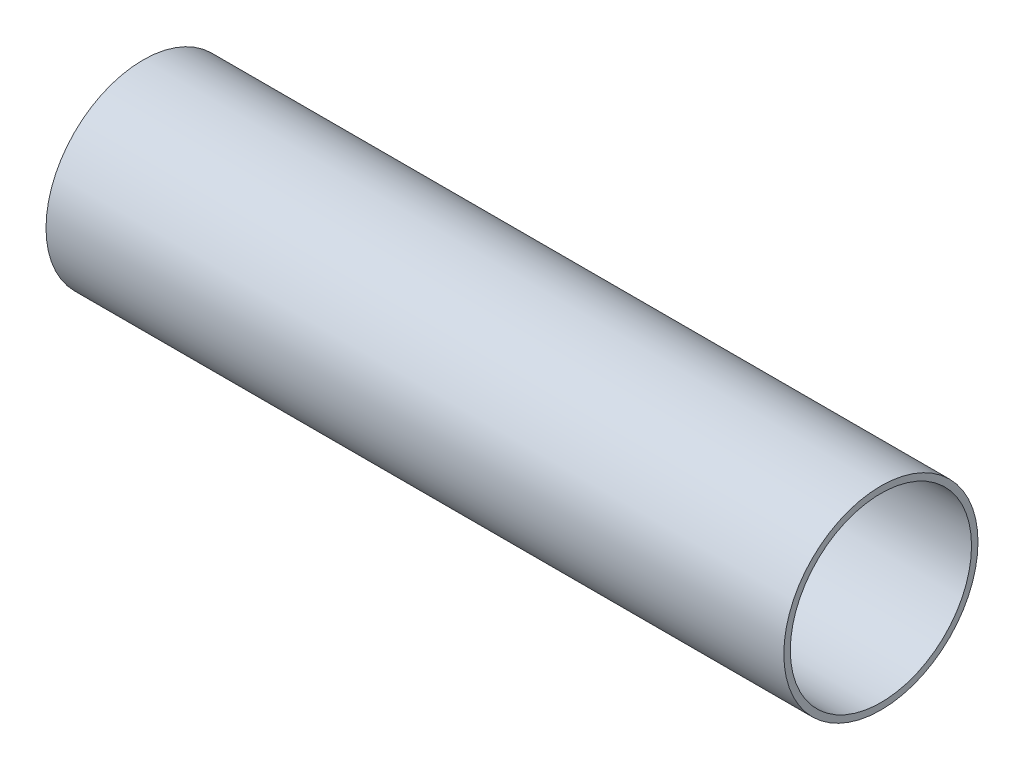
ISO-10303-21;
HEADER;
FILE_DESCRIPTION(('STEP AP214'),'2;1');
FILE_NAME('part.step','',(''),(''),'','','');
FILE_SCHEMA(('AUTOMOTIVE_DESIGN { 1 0 10303 214 1 1 1 1 }'));
ENDSEC;
DATA;
#1=APPLICATION_CONTEXT('core data for automotive mechanical design processes');
#2=APPLICATION_PROTOCOL_DEFINITION('international standard','automotive_design',2000,#1);
#3=PRODUCT_CONTEXT('',#1,'mechanical');
#4=PRODUCT('Part','Part','',(#3));
#5=PRODUCT_RELATED_PRODUCT_CATEGORY('part','',(#4));
#6=PRODUCT_DEFINITION_FORMATION('','',#4);
#7=PRODUCT_DEFINITION_CONTEXT('part definition',#1,'design');
#8=PRODUCT_DEFINITION('design','',#6,#7);
#9=PRODUCT_DEFINITION_SHAPE('','',#8);
#10=(LENGTH_UNIT() NAMED_UNIT(*) SI_UNIT(.MILLI.,.METRE.));
#11=(NAMED_UNIT(*) PLANE_ANGLE_UNIT() SI_UNIT($,.RADIAN.));
#12=(NAMED_UNIT(*) SI_UNIT($,.STERADIAN.) SOLID_ANGLE_UNIT());
#13=UNCERTAINTY_MEASURE_WITH_UNIT(LENGTH_MEASURE(1.E-05),#10,'distance_accuracy_value','');
#14=(GEOMETRIC_REPRESENTATION_CONTEXT(3) GLOBAL_UNCERTAINTY_ASSIGNED_CONTEXT((#13)) GLOBAL_UNIT_ASSIGNED_CONTEXT((#10,
#11,#12)) REPRESENTATION_CONTEXT('',''));
#15=CARTESIAN_POINT('',(0.,0.,0.));
#16=DIRECTION('',(0.,0.,1.));
#17=DIRECTION('',(1.,0.,0.));
#18=AXIS2_PLACEMENT_3D('',#15,#16,#17);
#19=CARTESIAN_POINT('',(-158.684210526312,0.,0.));
#20=DIRECTION('',(1.,0.,0.));
#21=DIRECTION('',(0.,0.,-1.));
#22=AXIS2_PLACEMENT_3D('',#19,#20,#21);
#23=PLANE('',#22);
#24=CARTESIAN_POINT('',(-158.684210526312,0.,0.));
#25=DIRECTION('',(-1.,0.,0.));
#26=DIRECTION('',(0.,0.,1.));
#27=AXIS2_PLACEMENT_3D('',#24,#25,#26);
#28=CIRCLE('',#27,70.);
#29=CARTESIAN_POINT('',(-158.684210526312,0.,70.));
#30=VERTEX_POINT('',#29);
#31=EDGE_CURVE('E10',#30,#30,#28,.T.);
#32=ORIENTED_EDGE('',*,*,#31,.F.);
#33=EDGE_LOOP('',(#32));
#34=FACE_BOUND('',#33,.T.);
#35=CARTESIAN_POINT('',(-158.684210526312,0.,0.));
#36=DIRECTION('',(-1.,0.,0.));
#37=DIRECTION('',(0.,0.,1.));
#38=AXIS2_PLACEMENT_3D('',#35,#36,#37);
#39=CIRCLE('',#38,75.);
#40=CARTESIAN_POINT('',(-158.684210526312,0.,75.));
#41=VERTEX_POINT('',#40);
#42=EDGE_CURVE('E63',#41,#41,#39,.T.);
#43=ORIENTED_EDGE('',*,*,#42,.T.);
#44=EDGE_LOOP('',(#43));
#45=FACE_BOUND('',#44,.T.);
#46=ADVANCED_FACE('F45',(#34,#45),#23,.F.);
#47=CARTESIAN_POINT('',(0.,0.,0.));
#48=DIRECTION('',(-1.,0.,0.));
#49=DIRECTION('',(0.,0.,1.));
#50=AXIS2_PLACEMENT_3D('',#47,#48,#49);
#51=CYLINDRICAL_SURFACE('',#50,70.);
#52=CARTESIAN_POINT('',(411.315789473688,0.,0.));
#53=DIRECTION('',(-1.,0.,0.));
#54=DIRECTION('',(0.,0.,1.));
#55=AXIS2_PLACEMENT_3D('',#52,#53,#54);
#56=CIRCLE('',#55,70.);
#57=CARTESIAN_POINT('',(411.315789473688,0.,70.));
#58=VERTEX_POINT('',#57);
#59=EDGE_CURVE('E52',#58,#58,#56,.T.);
#60=ORIENTED_EDGE('',*,*,#59,.F.);
#61=EDGE_LOOP('',(#60));
#62=FACE_BOUND('',#61,.T.);
#63=ORIENTED_EDGE('',*,*,#31,.T.);
#64=EDGE_LOOP('',(#63));
#65=FACE_BOUND('',#64,.T.);
#66=ADVANCED_FACE('F78',(#62,#65),#51,.F.);
#67=CARTESIAN_POINT('',(411.315789473688,0.,0.));
#68=DIRECTION('',(1.,0.,0.));
#69=DIRECTION('',(0.,0.,-1.));
#70=AXIS2_PLACEMENT_3D('',#67,#68,#69);
#71=PLANE('',#70);
#72=ORIENTED_EDGE('',*,*,#59,.T.);
#73=EDGE_LOOP('',(#72));
#74=FACE_BOUND('',#73,.T.);
#75=CARTESIAN_POINT('',(411.315789473688,0.,0.));
#76=DIRECTION('',(-1.,0.,0.));
#77=DIRECTION('',(0.,0.,1.));
#78=AXIS2_PLACEMENT_3D('',#75,#76,#77);
#79=CIRCLE('',#78,75.);
#80=CARTESIAN_POINT('',(411.315789473688,0.,75.));
#81=VERTEX_POINT('',#80);
#82=EDGE_CURVE('E58',#81,#81,#79,.T.);
#83=ORIENTED_EDGE('',*,*,#82,.F.);
#84=EDGE_LOOP('',(#83));
#85=FACE_BOUND('',#84,.T.);
#86=ADVANCED_FACE('F72',(#74,#85),#71,.T.);
#87=CARTESIAN_POINT('',(0.,0.,0.));
#88=DIRECTION('',(-1.,0.,0.));
#89=DIRECTION('',(0.,0.,1.));
#90=AXIS2_PLACEMENT_3D('',#87,#88,#89);
#91=CYLINDRICAL_SURFACE('',#90,75.);
#92=ORIENTED_EDGE('',*,*,#82,.T.);
#93=EDGE_LOOP('',(#92));
#94=FACE_BOUND('',#93,.T.);
#95=ORIENTED_EDGE('',*,*,#42,.F.);
#96=EDGE_LOOP('',(#95));
#97=FACE_BOUND('',#96,.T.);
#98=ADVANCED_FACE('F70',(#94,#97),#91,.T.);
#99=CLOSED_SHELL('',(#46,#66,#86,#98));
#100=MANIFOLD_SOLID_BREP('B2',#99);
#101=ADVANCED_BREP_SHAPE_REPRESENTATION('',(#18,#100),#14);
#102=SHAPE_DEFINITION_REPRESENTATION(#9,#101);
ENDSEC;
END-ISO-10303-21;
